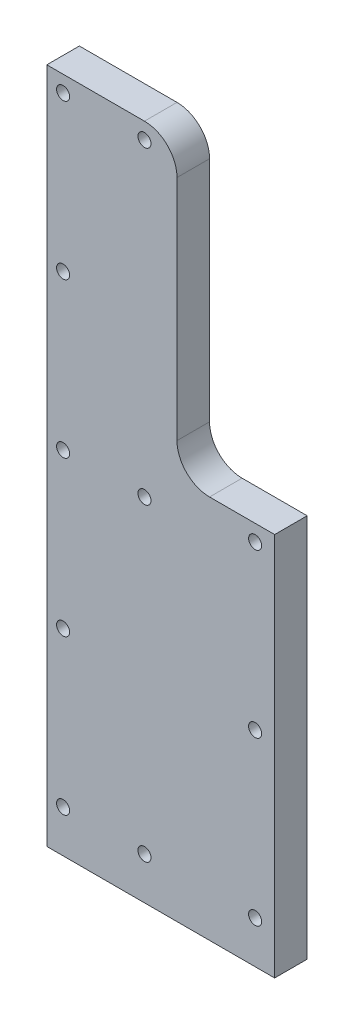
ISO-10303-21;
HEADER;
FILE_DESCRIPTION(('STEP AP214'),'2;1');
FILE_NAME('part.step','',(''),(''),'','','');
FILE_SCHEMA(('AUTOMOTIVE_DESIGN { 1 0 10303 214 1 1 1 1 }'));
ENDSEC;
DATA;
#1=APPLICATION_CONTEXT('core data for automotive mechanical design processes');
#2=APPLICATION_PROTOCOL_DEFINITION('international standard','automotive_design',2000,#1);
#3=PRODUCT_CONTEXT('',#1,'mechanical');
#4=PRODUCT('Part','Part','',(#3));
#5=PRODUCT_RELATED_PRODUCT_CATEGORY('part','',(#4));
#6=PRODUCT_DEFINITION_FORMATION('','',#4);
#7=PRODUCT_DEFINITION_CONTEXT('part definition',#1,'design');
#8=PRODUCT_DEFINITION('design','',#6,#7);
#9=PRODUCT_DEFINITION_SHAPE('','',#8);
#10=(LENGTH_UNIT() NAMED_UNIT(*) SI_UNIT(.MILLI.,.METRE.));
#11=(NAMED_UNIT(*) PLANE_ANGLE_UNIT() SI_UNIT($,.RADIAN.));
#12=(NAMED_UNIT(*) SI_UNIT($,.STERADIAN.) SOLID_ANGLE_UNIT());
#13=UNCERTAINTY_MEASURE_WITH_UNIT(LENGTH_MEASURE(1.E-05),#10,'distance_accuracy_value','');
#14=(GEOMETRIC_REPRESENTATION_CONTEXT(3) GLOBAL_UNCERTAINTY_ASSIGNED_CONTEXT((#13)) GLOBAL_UNIT_ASSIGNED_CONTEXT((#10,
#11,#12)) REPRESENTATION_CONTEXT('',''));
#15=CARTESIAN_POINT('',(0.,0.,0.));
#16=DIRECTION('',(0.,0.,1.));
#17=DIRECTION('',(1.,0.,0.));
#18=AXIS2_PLACEMENT_3D('',#15,#16,#17);
#19=CARTESIAN_POINT('',(70.,110.,10.));
#20=DIRECTION('',(-1.,0.,0.));
#21=DIRECTION('',(0.,-1.,0.));
#22=AXIS2_PLACEMENT_3D('',#19,#20,#21);
#23=PLANE('',#22);
#24=DIRECTION('',(0.,1.,0.));
#25=VECTOR('',#24,1.);
#26=CARTESIAN_POINT('',(70.,110.,0.));
#27=LINE('',#26,#25);
#28=CARTESIAN_POINT('',(70.,-8.,0.));
#29=VERTEX_POINT('',#28);
#30=CARTESIAN_POINT('',(70.,110.,0.));
#31=VERTEX_POINT('',#30);
#32=EDGE_CURVE('E142',#29,#31,#27,.T.);
#33=ORIENTED_EDGE('',*,*,#32,.T.);
#34=DIRECTION('',(0.,0.,-1.));
#35=VECTOR('',#34,1.);
#36=CARTESIAN_POINT('',(70.,110.,10.));
#37=LINE('',#36,#35);
#38=CARTESIAN_POINT('',(70.,110.,10.));
#39=VERTEX_POINT('',#38);
#40=EDGE_CURVE('E11',#39,#31,#37,.T.);
#41=ORIENTED_EDGE('',*,*,#40,.F.);
#42=DIRECTION('',(0.,1.,0.));
#43=VECTOR('',#42,1.);
#44=CARTESIAN_POINT('',(70.,110.,10.));
#45=LINE('',#44,#43);
#46=CARTESIAN_POINT('',(70.,-8.,10.));
#47=VERTEX_POINT('',#46);
#48=EDGE_CURVE('E100',#47,#39,#45,.T.);
#49=ORIENTED_EDGE('',*,*,#48,.F.);
#50=DIRECTION('',(0.,0.,1.));
#51=VECTOR('',#50,1.);
#52=CARTESIAN_POINT('',(70.,-8.,0.));
#53=LINE('',#52,#51);
#54=EDGE_CURVE('E198',#29,#47,#53,.T.);
#55=ORIENTED_EDGE('',*,*,#54,.F.);
#56=EDGE_LOOP('',(#33,#41,#49,#55));
#57=FACE_BOUND('',#56,.T.);
#58=ADVANCED_FACE('F45',(#57),#23,.F.);
#59=CARTESIAN_POINT('',(50.,110.,10.));
#60=DIRECTION('',(0.,-1.,0.));
#61=DIRECTION('',(0.,0.,-1.));
#62=AXIS2_PLACEMENT_3D('',#59,#60,#61);
#63=PLANE('',#62);
#64=DIRECTION('',(-1.,0.,0.));
#65=VECTOR('',#64,1.);
#66=CARTESIAN_POINT('',(50.,110.,0.));
#67=LINE('',#66,#65);
#68=CARTESIAN_POINT('',(50.,110.,0.));
#69=VERTEX_POINT('',#68);
#70=EDGE_CURVE('E145',#31,#69,#67,.T.);
#71=ORIENTED_EDGE('',*,*,#70,.T.);
#72=DIRECTION('',(0.,0.,-1.));
#73=VECTOR('',#72,1.);
#74=CARTESIAN_POINT('',(50.,110.,10.));
#75=LINE('',#74,#73);
#76=CARTESIAN_POINT('',(50.,110.,10.));
#77=VERTEX_POINT('',#76);
#78=EDGE_CURVE('E54',#77,#69,#75,.T.);
#79=ORIENTED_EDGE('',*,*,#78,.F.);
#80=DIRECTION('',(-1.,0.,0.));
#81=VECTOR('',#80,1.);
#82=CARTESIAN_POINT('',(50.,110.,10.));
#83=LINE('',#82,#81);
#84=EDGE_CURVE('E295',#39,#77,#83,.T.);
#85=ORIENTED_EDGE('',*,*,#84,.F.);
#86=ORIENTED_EDGE('',*,*,#40,.T.);
#87=EDGE_LOOP('',(#71,#79,#85,#86));
#88=FACE_BOUND('',#87,.T.);
#89=ADVANCED_FACE('F298',(#88),#63,.F.);
#90=CARTESIAN_POINT('',(50.,120.,10.));
#91=DIRECTION('',(0.,0.,-1.));
#92=DIRECTION('',(-1.,0.,0.));
#93=AXIS2_PLACEMENT_3D('',#90,#91,#92);
#94=CYLINDRICAL_SURFACE('',#93,10.);
#95=CARTESIAN_POINT('',(50.,120.,0.));
#96=DIRECTION('',(0.,0.,-1.));
#97=DIRECTION('',(1.,0.,0.));
#98=AXIS2_PLACEMENT_3D('',#95,#96,#97);
#99=CIRCLE('',#98,10.);
#100=CARTESIAN_POINT('',(40.,120.,0.));
#101=VERTEX_POINT('',#100);
#102=EDGE_CURVE('E149',#69,#101,#99,.T.);
#103=ORIENTED_EDGE('',*,*,#102,.T.);
#104=DIRECTION('',(0.,0.,-1.));
#105=VECTOR('',#104,1.);
#106=CARTESIAN_POINT('',(40.,120.,10.));
#107=LINE('',#106,#105);
#108=CARTESIAN_POINT('',(40.,120.,10.));
#109=VERTEX_POINT('',#108);
#110=EDGE_CURVE('E128',#109,#101,#107,.T.);
#111=ORIENTED_EDGE('',*,*,#110,.F.);
#112=CARTESIAN_POINT('',(50.,120.,10.));
#113=DIRECTION('',(0.,0.,-1.));
#114=DIRECTION('',(1.,0.,0.));
#115=AXIS2_PLACEMENT_3D('',#112,#113,#114);
#116=CIRCLE('',#115,10.);
#117=EDGE_CURVE('E117',#77,#109,#116,.T.);
#118=ORIENTED_EDGE('',*,*,#117,.F.);
#119=ORIENTED_EDGE('',*,*,#78,.T.);
#120=EDGE_LOOP('',(#103,#111,#118,#119));
#121=FACE_BOUND('',#120,.T.);
#122=ADVANCED_FACE('F172',(#121),#94,.F.);
#123=CARTESIAN_POINT('',(40.,190.,10.));
#124=DIRECTION('',(-1.,0.,0.));
#125=DIRECTION('',(0.,-1.,0.));
#126=AXIS2_PLACEMENT_3D('',#123,#124,#125);
#127=PLANE('',#126);
#128=DIRECTION('',(0.,1.,0.));
#129=VECTOR('',#128,1.);
#130=CARTESIAN_POINT('',(40.,190.,0.));
#131=LINE('',#130,#129);
#132=CARTESIAN_POINT('',(40.,190.,0.));
#133=VERTEX_POINT('',#132);
#134=EDGE_CURVE('E126',#101,#133,#131,.T.);
#135=ORIENTED_EDGE('',*,*,#134,.T.);
#136=DIRECTION('',(0.,0.,-1.));
#137=VECTOR('',#136,1.);
#138=CARTESIAN_POINT('',(40.,190.,10.));
#139=LINE('',#138,#137);
#140=CARTESIAN_POINT('',(40.,190.,10.));
#141=VERTEX_POINT('',#140);
#142=EDGE_CURVE('E123',#141,#133,#139,.T.);
#143=ORIENTED_EDGE('',*,*,#142,.F.);
#144=DIRECTION('',(0.,1.,0.));
#145=VECTOR('',#144,1.);
#146=CARTESIAN_POINT('',(40.,190.,10.));
#147=LINE('',#146,#145);
#148=EDGE_CURVE('E111',#109,#141,#147,.T.);
#149=ORIENTED_EDGE('',*,*,#148,.F.);
#150=ORIENTED_EDGE('',*,*,#110,.T.);
#151=EDGE_LOOP('',(#135,#143,#149,#150));
#152=FACE_BOUND('',#151,.T.);
#153=ADVANCED_FACE('F124',(#152),#127,.F.);
#154=CARTESIAN_POINT('',(30.,190.,10.));
#155=DIRECTION('',(0.,0.,-1.));
#156=DIRECTION('',(-1.,0.,0.));
#157=AXIS2_PLACEMENT_3D('',#154,#155,#156);
#158=CYLINDRICAL_SURFACE('',#157,10.);
#159=CARTESIAN_POINT('',(30.,190.,0.));
#160=DIRECTION('',(0.,0.,1.));
#161=DIRECTION('',(-1.,0.,0.));
#162=AXIS2_PLACEMENT_3D('',#159,#160,#161);
#163=CIRCLE('',#162,10.);
#164=CARTESIAN_POINT('',(30.,200.,0.));
#165=VERTEX_POINT('',#164);
#166=EDGE_CURVE('E86',#133,#165,#163,.T.);
#167=ORIENTED_EDGE('',*,*,#166,.T.);
#168=DIRECTION('',(0.,0.,-1.));
#169=VECTOR('',#168,1.);
#170=CARTESIAN_POINT('',(30.,200.,10.));
#171=LINE('',#170,#169);
#172=CARTESIAN_POINT('',(30.,200.,10.));
#173=VERTEX_POINT('',#172);
#174=EDGE_CURVE('E129',#173,#165,#171,.T.);
#175=ORIENTED_EDGE('',*,*,#174,.F.);
#176=CARTESIAN_POINT('',(30.,190.,10.));
#177=DIRECTION('',(0.,0.,1.));
#178=DIRECTION('',(-1.,0.,0.));
#179=AXIS2_PLACEMENT_3D('',#176,#177,#178);
#180=CIRCLE('',#179,10.);
#181=EDGE_CURVE('E115',#141,#173,#180,.T.);
#182=ORIENTED_EDGE('',*,*,#181,.F.);
#183=ORIENTED_EDGE('',*,*,#142,.T.);
#184=EDGE_LOOP('',(#167,#175,#182,#183));
#185=FACE_BOUND('',#184,.T.);
#186=ADVANCED_FACE('F131',(#185),#158,.T.);
#187=CARTESIAN_POINT('',(0.,200.,10.));
#188=DIRECTION('',(0.,-1.,0.));
#189=DIRECTION('',(0.,0.,-1.));
#190=AXIS2_PLACEMENT_3D('',#187,#188,#189);
#191=PLANE('',#190);
#192=DIRECTION('',(-1.,0.,0.));
#193=VECTOR('',#192,1.);
#194=CARTESIAN_POINT('',(0.,200.,0.));
#195=LINE('',#194,#193);
#196=CARTESIAN_POINT('',(0.,200.,0.));
#197=VERTEX_POINT('',#196);
#198=EDGE_CURVE('E92',#165,#197,#195,.T.);
#199=ORIENTED_EDGE('',*,*,#198,.T.);
#200=DIRECTION('',(0.,0.,-1.));
#201=VECTOR('',#200,1.);
#202=CARTESIAN_POINT('',(0.,200.,10.));
#203=LINE('',#202,#201);
#204=CARTESIAN_POINT('',(0.,200.,10.));
#205=VERTEX_POINT('',#204);
#206=EDGE_CURVE('E141',#205,#197,#203,.T.);
#207=ORIENTED_EDGE('',*,*,#206,.F.);
#208=DIRECTION('',(-1.,0.,0.));
#209=VECTOR('',#208,1.);
#210=CARTESIAN_POINT('',(0.,200.,10.));
#211=LINE('',#210,#209);
#212=EDGE_CURVE('E62',#173,#205,#211,.T.);
#213=ORIENTED_EDGE('',*,*,#212,.F.);
#214=ORIENTED_EDGE('',*,*,#174,.T.);
#215=EDGE_LOOP('',(#199,#207,#213,#214));
#216=FACE_BOUND('',#215,.T.);
#217=ADVANCED_FACE('F318',(#216),#191,.F.);
#218=CARTESIAN_POINT('',(0.,0.,10.));
#219=DIRECTION('',(1.,0.,0.));
#220=DIRECTION('',(0.,0.,-1.));
#221=AXIS2_PLACEMENT_3D('',#218,#219,#220);
#222=PLANE('',#221);
#223=DIRECTION('',(0.,-1.,0.));
#224=VECTOR('',#223,1.);
#225=CARTESIAN_POINT('',(0.,0.,0.));
#226=LINE('',#225,#224);
#227=CARTESIAN_POINT('',(0.,-8.00000000000001,0.));
#228=VERTEX_POINT('',#227);
#229=EDGE_CURVE('E158',#197,#228,#226,.T.);
#230=ORIENTED_EDGE('',*,*,#229,.T.);
#231=DIRECTION('',(0.,0.,1.));
#232=VECTOR('',#231,1.);
#233=CARTESIAN_POINT('',(0.,-8.00000000000001,0.));
#234=LINE('',#233,#232);
#235=CARTESIAN_POINT('',(0.,-8.00000000000001,10.));
#236=VERTEX_POINT('',#235);
#237=EDGE_CURVE('E190',#228,#236,#234,.T.);
#238=ORIENTED_EDGE('',*,*,#237,.T.);
#239=DIRECTION('',(0.,-1.,0.));
#240=VECTOR('',#239,1.);
#241=CARTESIAN_POINT('',(0.,0.,10.));
#242=LINE('',#241,#240);
#243=EDGE_CURVE('E135',#205,#236,#242,.T.);
#244=ORIENTED_EDGE('',*,*,#243,.F.);
#245=ORIENTED_EDGE('',*,*,#206,.T.);
#246=EDGE_LOOP('',(#230,#238,#244,#245));
#247=FACE_BOUND('',#246,.T.);
#248=ADVANCED_FACE('F187',(#247),#222,.F.);
#249=CARTESIAN_POINT('',(30.,190.,10.));
#250=DIRECTION('',(0.,0.,-1.));
#251=DIRECTION('',(-1.,0.,0.));
#252=AXIS2_PLACEMENT_3D('',#249,#250,#251);
#253=PLANE('',#252);
#254=CARTESIAN_POINT('',(5.00000000000049,147.5,10.));
#255=DIRECTION('',(0.,0.,1.));
#256=DIRECTION('',(1.,0.,0.));
#257=AXIS2_PLACEMENT_3D('',#254,#255,#256);
#258=CIRCLE('',#257,2.);
#259=CARTESIAN_POINT('',(7.0000000000005,147.5,10.));
#260=VERTEX_POINT('',#259);
#261=EDGE_CURVE('E223',#260,#260,#258,.T.);
#262=ORIENTED_EDGE('',*,*,#261,.F.);
#263=EDGE_LOOP('',(#262));
#264=FACE_BOUND('',#263,.T.);
#265=CARTESIAN_POINT('',(5.00000000000099,100.,10.));
#266=DIRECTION('',(0.,0.,1.));
#267=DIRECTION('',(1.,0.,0.));
#268=AXIS2_PLACEMENT_3D('',#265,#266,#267);
#269=CIRCLE('',#268,2.);
#270=CARTESIAN_POINT('',(7.00000000000099,100.,10.));
#271=VERTEX_POINT('',#270);
#272=EDGE_CURVE('E232',#271,#271,#269,.T.);
#273=ORIENTED_EDGE('',*,*,#272,.F.);
#274=EDGE_LOOP('',(#273));
#275=FACE_BOUND('',#274,.T.);
#276=CARTESIAN_POINT('',(5.00000000000148,52.5,10.));
#277=DIRECTION('',(0.,0.,1.));
#278=DIRECTION('',(1.,0.,0.));
#279=AXIS2_PLACEMENT_3D('',#276,#277,#278);
#280=CIRCLE('',#279,2.);
#281=CARTESIAN_POINT('',(7.00000000000149,52.5,10.));
#282=VERTEX_POINT('',#281);
#283=EDGE_CURVE('E240',#282,#282,#280,.T.);
#284=ORIENTED_EDGE('',*,*,#283,.F.);
#285=EDGE_LOOP('',(#284));
#286=FACE_BOUND('',#285,.T.);
#287=CARTESIAN_POINT('',(5.00000000000197,5.,10.));
#288=DIRECTION('',(0.,0.,1.));
#289=DIRECTION('',(1.,0.,0.));
#290=AXIS2_PLACEMENT_3D('',#287,#288,#289);
#291=CIRCLE('',#290,2.);
#292=CARTESIAN_POINT('',(7.00000000000197,5.,10.));
#293=VERTEX_POINT('',#292);
#294=EDGE_CURVE('E248',#293,#293,#291,.T.);
#295=ORIENTED_EDGE('',*,*,#294,.F.);
#296=EDGE_LOOP('',(#295));
#297=FACE_BOUND('',#296,.T.);
#298=CARTESIAN_POINT('',(30.,195.,10.));
#299=DIRECTION('',(0.,0.,1.));
#300=DIRECTION('',(1.,0.,0.));
#301=AXIS2_PLACEMENT_3D('',#298,#299,#300);
#302=CIRCLE('',#301,2.);
#303=CARTESIAN_POINT('',(32.,195.,10.));
#304=VERTEX_POINT('',#303);
#305=EDGE_CURVE('E266',#304,#304,#302,.T.);
#306=ORIENTED_EDGE('',*,*,#305,.F.);
#307=EDGE_LOOP('',(#306));
#308=FACE_BOUND('',#307,.T.);
#309=CARTESIAN_POINT('',(64.0000000000011,5.,10.));
#310=DIRECTION('',(0.,0.,1.));
#311=DIRECTION('',(1.,0.,0.));
#312=AXIS2_PLACEMENT_3D('',#309,#310,#311);
#313=CIRCLE('',#312,2.);
#314=CARTESIAN_POINT('',(66.0000000000011,5.,10.));
#315=VERTEX_POINT('',#314);
#316=EDGE_CURVE('E257',#315,#315,#313,.T.);
#317=ORIENTED_EDGE('',*,*,#316,.F.);
#318=EDGE_LOOP('',(#317));
#319=FACE_BOUND('',#318,.T.);
#320=CARTESIAN_POINT('',(64.0000000000005,55.,10.));
#321=DIRECTION('',(0.,0.,1.));
#322=DIRECTION('',(1.,0.,0.));
#323=AXIS2_PLACEMENT_3D('',#320,#321,#322);
#324=CIRCLE('',#323,2.);
#325=CARTESIAN_POINT('',(66.0000000000005,55.,10.));
#326=VERTEX_POINT('',#325);
#327=EDGE_CURVE('E280',#326,#326,#324,.T.);
#328=ORIENTED_EDGE('',*,*,#327,.F.);
#329=EDGE_LOOP('',(#328));
#330=FACE_BOUND('',#329,.T.);
#331=CARTESIAN_POINT('',(64.,105.,10.));
#332=DIRECTION('',(0.,0.,1.));
#333=DIRECTION('',(1.,0.,0.));
#334=AXIS2_PLACEMENT_3D('',#331,#332,#333);
#335=CIRCLE('',#334,2.);
#336=CARTESIAN_POINT('',(66.,105.,10.));
#337=VERTEX_POINT('',#336);
#338=EDGE_CURVE('E256',#337,#337,#335,.T.);
#339=ORIENTED_EDGE('',*,*,#338,.F.);
#340=EDGE_LOOP('',(#339));
#341=FACE_BOUND('',#340,.T.);
#342=CARTESIAN_POINT('',(30.000000000001,100.,10.));
#343=DIRECTION('',(0.,0.,1.));
#344=DIRECTION('',(1.,0.,0.));
#345=AXIS2_PLACEMENT_3D('',#342,#343,#344);
#346=CIRCLE('',#345,2.);
#347=CARTESIAN_POINT('',(32.000000000001,100.,10.));
#348=VERTEX_POINT('',#347);
#349=EDGE_CURVE('E207',#348,#348,#346,.T.);
#350=ORIENTED_EDGE('',*,*,#349,.F.);
#351=EDGE_LOOP('',(#350));
#352=FACE_BOUND('',#351,.T.);
#353=CARTESIAN_POINT('',(30.000000000002,5.,10.));
#354=DIRECTION('',(0.,0.,1.));
#355=DIRECTION('',(1.,0.,0.));
#356=AXIS2_PLACEMENT_3D('',#353,#354,#355);
#357=CIRCLE('',#356,2.);
#358=CARTESIAN_POINT('',(32.000000000002,5.,10.));
#359=VERTEX_POINT('',#358);
#360=EDGE_CURVE('E216',#359,#359,#357,.T.);
#361=ORIENTED_EDGE('',*,*,#360,.F.);
#362=EDGE_LOOP('',(#361));
#363=FACE_BOUND('',#362,.T.);
#364=CARTESIAN_POINT('',(5.,195.,10.));
#365=DIRECTION('',(0.,0.,1.));
#366=DIRECTION('',(1.,0.,0.));
#367=AXIS2_PLACEMENT_3D('',#364,#365,#366);
#368=CIRCLE('',#367,2.);
#369=CARTESIAN_POINT('',(7.,195.,10.));
#370=VERTEX_POINT('',#369);
#371=EDGE_CURVE('E227',#370,#370,#368,.T.);
#372=ORIENTED_EDGE('',*,*,#371,.F.);
#373=EDGE_LOOP('',(#372));
#374=FACE_BOUND('',#373,.T.);
#375=ORIENTED_EDGE('',*,*,#243,.T.);
#376=DIRECTION('',(1.,0.,0.));
#377=VECTOR('',#376,1.);
#378=CARTESIAN_POINT('',(70.,-8.,10.));
#379=LINE('',#378,#377);
#380=EDGE_CURVE('E196',#236,#47,#379,.T.);
#381=ORIENTED_EDGE('',*,*,#380,.T.);
#382=ORIENTED_EDGE('',*,*,#48,.T.);
#383=ORIENTED_EDGE('',*,*,#84,.T.);
#384=ORIENTED_EDGE('',*,*,#117,.T.);
#385=ORIENTED_EDGE('',*,*,#148,.T.);
#386=ORIENTED_EDGE('',*,*,#181,.T.);
#387=ORIENTED_EDGE('',*,*,#212,.T.);
#388=EDGE_LOOP('',(#375,#381,#382,#383,#384,#385,#386,#387));
#389=FACE_BOUND('',#388,.T.);
#390=ADVANCED_FACE('F113',(#264,#275,#286,#297,#308,#319,#330,#341,#352,#363,#374,#389),#253,.F.);
#391=CARTESIAN_POINT('',(30.,190.,0.));
#392=DIRECTION('',(0.,0.,-1.));
#393=DIRECTION('',(-1.,0.,0.));
#394=AXIS2_PLACEMENT_3D('',#391,#392,#393);
#395=PLANE('',#394);
#396=CARTESIAN_POINT('',(5.00000000000049,147.5,0.));
#397=DIRECTION('',(0.,0.,1.));
#398=DIRECTION('',(1.,0.,0.));
#399=AXIS2_PLACEMENT_3D('',#396,#397,#398);
#400=CIRCLE('',#399,2.);
#401=CARTESIAN_POINT('',(7.0000000000005,147.5,0.));
#402=VERTEX_POINT('',#401);
#403=EDGE_CURVE('E228',#402,#402,#400,.T.);
#404=ORIENTED_EDGE('',*,*,#403,.T.);
#405=EDGE_LOOP('',(#404));
#406=FACE_BOUND('',#405,.T.);
#407=CARTESIAN_POINT('',(5.00000000000099,100.,0.));
#408=DIRECTION('',(0.,0.,1.));
#409=DIRECTION('',(1.,0.,0.));
#410=AXIS2_PLACEMENT_3D('',#407,#408,#409);
#411=CIRCLE('',#410,2.);
#412=CARTESIAN_POINT('',(7.00000000000099,100.,0.));
#413=VERTEX_POINT('',#412);
#414=EDGE_CURVE('E236',#413,#413,#411,.T.);
#415=ORIENTED_EDGE('',*,*,#414,.T.);
#416=EDGE_LOOP('',(#415));
#417=FACE_BOUND('',#416,.T.);
#418=CARTESIAN_POINT('',(5.00000000000148,52.5,0.));
#419=DIRECTION('',(0.,0.,1.));
#420=DIRECTION('',(1.,0.,0.));
#421=AXIS2_PLACEMENT_3D('',#418,#419,#420);
#422=CIRCLE('',#421,2.);
#423=CARTESIAN_POINT('',(7.00000000000149,52.5,0.));
#424=VERTEX_POINT('',#423);
#425=EDGE_CURVE('E244',#424,#424,#422,.T.);
#426=ORIENTED_EDGE('',*,*,#425,.T.);
#427=EDGE_LOOP('',(#426));
#428=FACE_BOUND('',#427,.T.);
#429=CARTESIAN_POINT('',(5.00000000000197,5.,0.));
#430=DIRECTION('',(0.,0.,1.));
#431=DIRECTION('',(1.,0.,0.));
#432=AXIS2_PLACEMENT_3D('',#429,#430,#431);
#433=CIRCLE('',#432,2.);
#434=CARTESIAN_POINT('',(7.00000000000197,5.,0.));
#435=VERTEX_POINT('',#434);
#436=EDGE_CURVE('E252',#435,#435,#433,.T.);
#437=ORIENTED_EDGE('',*,*,#436,.T.);
#438=EDGE_LOOP('',(#437));
#439=FACE_BOUND('',#438,.T.);
#440=CARTESIAN_POINT('',(30.,195.,0.));
#441=DIRECTION('',(0.,0.,1.));
#442=DIRECTION('',(1.,0.,0.));
#443=AXIS2_PLACEMENT_3D('',#440,#441,#442);
#444=CIRCLE('',#443,2.);
#445=CARTESIAN_POINT('',(32.,195.,0.));
#446=VERTEX_POINT('',#445);
#447=EDGE_CURVE('E211',#446,#446,#444,.T.);
#448=ORIENTED_EDGE('',*,*,#447,.T.);
#449=EDGE_LOOP('',(#448));
#450=FACE_BOUND('',#449,.T.);
#451=CARTESIAN_POINT('',(64.0000000000011,5.,0.));
#452=DIRECTION('',(0.,0.,1.));
#453=DIRECTION('',(1.,0.,0.));
#454=AXIS2_PLACEMENT_3D('',#451,#452,#453);
#455=CIRCLE('',#454,2.);
#456=CARTESIAN_POINT('',(66.0000000000011,5.,0.));
#457=VERTEX_POINT('',#456);
#458=EDGE_CURVE('E262',#457,#457,#455,.T.);
#459=ORIENTED_EDGE('',*,*,#458,.T.);
#460=EDGE_LOOP('',(#459));
#461=FACE_BOUND('',#460,.T.);
#462=CARTESIAN_POINT('',(64.0000000000005,55.,0.));
#463=DIRECTION('',(0.,0.,1.));
#464=DIRECTION('',(1.,0.,0.));
#465=AXIS2_PLACEMENT_3D('',#462,#463,#464);
#466=CIRCLE('',#465,2.);
#467=CARTESIAN_POINT('',(66.0000000000005,55.,0.));
#468=VERTEX_POINT('',#467);
#469=EDGE_CURVE('E261',#468,#468,#466,.T.);
#470=ORIENTED_EDGE('',*,*,#469,.T.);
#471=EDGE_LOOP('',(#470));
#472=FACE_BOUND('',#471,.T.);
#473=CARTESIAN_POINT('',(64.,105.,0.));
#474=DIRECTION('',(0.,0.,1.));
#475=DIRECTION('',(1.,0.,0.));
#476=AXIS2_PLACEMENT_3D('',#473,#474,#475);
#477=CIRCLE('',#476,2.);
#478=CARTESIAN_POINT('',(66.,105.,0.));
#479=VERTEX_POINT('',#478);
#480=EDGE_CURVE('E276',#479,#479,#477,.T.);
#481=ORIENTED_EDGE('',*,*,#480,.T.);
#482=EDGE_LOOP('',(#481));
#483=FACE_BOUND('',#482,.T.);
#484=CARTESIAN_POINT('',(30.000000000001,100.,0.));
#485=DIRECTION('',(0.,0.,1.));
#486=DIRECTION('',(1.,0.,0.));
#487=AXIS2_PLACEMENT_3D('',#484,#485,#486);
#488=CIRCLE('',#487,2.);
#489=CARTESIAN_POINT('',(32.000000000001,100.,0.));
#490=VERTEX_POINT('',#489);
#491=EDGE_CURVE('E212',#490,#490,#488,.T.);
#492=ORIENTED_EDGE('',*,*,#491,.T.);
#493=EDGE_LOOP('',(#492));
#494=FACE_BOUND('',#493,.T.);
#495=CARTESIAN_POINT('',(30.000000000002,5.,0.));
#496=DIRECTION('',(0.,0.,1.));
#497=DIRECTION('',(1.,0.,0.));
#498=AXIS2_PLACEMENT_3D('',#495,#496,#497);
#499=CIRCLE('',#498,2.);
#500=CARTESIAN_POINT('',(32.000000000002,5.,0.));
#501=VERTEX_POINT('',#500);
#502=EDGE_CURVE('E202',#501,#501,#499,.T.);
#503=ORIENTED_EDGE('',*,*,#502,.T.);
#504=EDGE_LOOP('',(#503));
#505=FACE_BOUND('',#504,.T.);
#506=CARTESIAN_POINT('',(5.,195.,0.));
#507=DIRECTION('',(0.,0.,1.));
#508=DIRECTION('',(1.,0.,0.));
#509=AXIS2_PLACEMENT_3D('',#506,#507,#508);
#510=CIRCLE('',#509,2.);
#511=CARTESIAN_POINT('',(7.,195.,0.));
#512=VERTEX_POINT('',#511);
#513=EDGE_CURVE('E146',#512,#512,#510,.T.);
#514=ORIENTED_EDGE('',*,*,#513,.T.);
#515=EDGE_LOOP('',(#514));
#516=FACE_BOUND('',#515,.T.);
#517=ORIENTED_EDGE('',*,*,#32,.F.);
#518=DIRECTION('',(1.,0.,0.));
#519=VECTOR('',#518,1.);
#520=CARTESIAN_POINT('',(70.,-8.,0.));
#521=LINE('',#520,#519);
#522=EDGE_CURVE('E183',#228,#29,#521,.T.);
#523=ORIENTED_EDGE('',*,*,#522,.F.);
#524=ORIENTED_EDGE('',*,*,#229,.F.);
#525=ORIENTED_EDGE('',*,*,#198,.F.);
#526=ORIENTED_EDGE('',*,*,#166,.F.);
#527=ORIENTED_EDGE('',*,*,#134,.F.);
#528=ORIENTED_EDGE('',*,*,#102,.F.);
#529=ORIENTED_EDGE('',*,*,#70,.F.);
#530=EDGE_LOOP('',(#517,#523,#524,#525,#526,#527,#528,#529));
#531=FACE_BOUND('',#530,.T.);
#532=ADVANCED_FACE('F178',(#406,#417,#428,#439,#450,#461,#472,#483,#494,#505,#516,#531),#395,.T.);
#533=CARTESIAN_POINT('',(5.,195.,0.));
#534=DIRECTION('',(0.,0.,1.));
#535=DIRECTION('',(1.,0.,0.));
#536=AXIS2_PLACEMENT_3D('',#533,#534,#535);
#537=CYLINDRICAL_SURFACE('',#536,2.);
#538=ORIENTED_EDGE('',*,*,#513,.F.);
#539=EDGE_LOOP('',(#538));
#540=FACE_BOUND('',#539,.T.);
#541=ORIENTED_EDGE('',*,*,#371,.T.);
#542=EDGE_LOOP('',(#541));
#543=FACE_BOUND('',#542,.T.);
#544=ADVANCED_FACE('F324',(#540,#543),#537,.F.);
#545=CARTESIAN_POINT('',(30.000000000002,5.,0.));
#546=DIRECTION('',(0.,0.,1.));
#547=DIRECTION('',(1.,0.,0.));
#548=AXIS2_PLACEMENT_3D('',#545,#546,#547);
#549=CYLINDRICAL_SURFACE('',#548,2.);
#550=ORIENTED_EDGE('',*,*,#502,.F.);
#551=EDGE_LOOP('',(#550));
#552=FACE_BOUND('',#551,.T.);
#553=ORIENTED_EDGE('',*,*,#360,.T.);
#554=EDGE_LOOP('',(#553));
#555=FACE_BOUND('',#554,.T.);
#556=ADVANCED_FACE('F331',(#552,#555),#549,.F.);
#557=CARTESIAN_POINT('',(30.000000000001,100.,0.));
#558=DIRECTION('',(0.,0.,1.));
#559=DIRECTION('',(1.,0.,0.));
#560=AXIS2_PLACEMENT_3D('',#557,#558,#559);
#561=CYLINDRICAL_SURFACE('',#560,2.);
#562=ORIENTED_EDGE('',*,*,#491,.F.);
#563=EDGE_LOOP('',(#562));
#564=FACE_BOUND('',#563,.T.);
#565=ORIENTED_EDGE('',*,*,#349,.T.);
#566=EDGE_LOOP('',(#565));
#567=FACE_BOUND('',#566,.T.);
#568=ADVANCED_FACE('F341',(#564,#567),#561,.F.);
#569=CARTESIAN_POINT('',(64.,105.,0.));
#570=DIRECTION('',(0.,0.,1.));
#571=DIRECTION('',(1.,0.,0.));
#572=AXIS2_PLACEMENT_3D('',#569,#570,#571);
#573=CYLINDRICAL_SURFACE('',#572,2.);
#574=ORIENTED_EDGE('',*,*,#480,.F.);
#575=EDGE_LOOP('',(#574));
#576=FACE_BOUND('',#575,.T.);
#577=ORIENTED_EDGE('',*,*,#338,.T.);
#578=EDGE_LOOP('',(#577));
#579=FACE_BOUND('',#578,.T.);
#580=ADVANCED_FACE('F337',(#576,#579),#573,.F.);
#581=CARTESIAN_POINT('',(64.0000000000005,55.,0.));
#582=DIRECTION('',(0.,0.,1.));
#583=DIRECTION('',(1.,0.,0.));
#584=AXIS2_PLACEMENT_3D('',#581,#582,#583);
#585=CYLINDRICAL_SURFACE('',#584,2.);
#586=ORIENTED_EDGE('',*,*,#469,.F.);
#587=EDGE_LOOP('',(#586));
#588=FACE_BOUND('',#587,.T.);
#589=ORIENTED_EDGE('',*,*,#327,.T.);
#590=EDGE_LOOP('',(#589));
#591=FACE_BOUND('',#590,.T.);
#592=ADVANCED_FACE('F333',(#588,#591),#585,.F.);
#593=CARTESIAN_POINT('',(64.0000000000011,5.,0.));
#594=DIRECTION('',(0.,0.,1.));
#595=DIRECTION('',(1.,0.,0.));
#596=AXIS2_PLACEMENT_3D('',#593,#594,#595);
#597=CYLINDRICAL_SURFACE('',#596,2.);
#598=ORIENTED_EDGE('',*,*,#458,.F.);
#599=EDGE_LOOP('',(#598));
#600=FACE_BOUND('',#599,.T.);
#601=ORIENTED_EDGE('',*,*,#316,.T.);
#602=EDGE_LOOP('',(#601));
#603=FACE_BOUND('',#602,.T.);
#604=ADVANCED_FACE('F336',(#600,#603),#597,.F.);
#605=CARTESIAN_POINT('',(30.,195.,0.));
#606=DIRECTION('',(0.,0.,1.));
#607=DIRECTION('',(1.,0.,0.));
#608=AXIS2_PLACEMENT_3D('',#605,#606,#607);
#609=CYLINDRICAL_SURFACE('',#608,2.);
#610=ORIENTED_EDGE('',*,*,#447,.F.);
#611=EDGE_LOOP('',(#610));
#612=FACE_BOUND('',#611,.T.);
#613=ORIENTED_EDGE('',*,*,#305,.T.);
#614=EDGE_LOOP('',(#613));
#615=FACE_BOUND('',#614,.T.);
#616=ADVANCED_FACE('F343',(#612,#615),#609,.F.);
#617=CARTESIAN_POINT('',(5.00000000000197,5.,0.));
#618=DIRECTION('',(0.,0.,1.));
#619=DIRECTION('',(1.,0.,0.));
#620=AXIS2_PLACEMENT_3D('',#617,#618,#619);
#621=CYLINDRICAL_SURFACE('',#620,2.);
#622=ORIENTED_EDGE('',*,*,#436,.F.);
#623=EDGE_LOOP('',(#622));
#624=FACE_BOUND('',#623,.T.);
#625=ORIENTED_EDGE('',*,*,#294,.T.);
#626=EDGE_LOOP('',(#625));
#627=FACE_BOUND('',#626,.T.);
#628=ADVANCED_FACE('F346',(#624,#627),#621,.F.);
#629=CARTESIAN_POINT('',(5.00000000000148,52.5,0.));
#630=DIRECTION('',(0.,0.,1.));
#631=DIRECTION('',(1.,0.,0.));
#632=AXIS2_PLACEMENT_3D('',#629,#630,#631);
#633=CYLINDRICAL_SURFACE('',#632,2.);
#634=ORIENTED_EDGE('',*,*,#425,.F.);
#635=EDGE_LOOP('',(#634));
#636=FACE_BOUND('',#635,.T.);
#637=ORIENTED_EDGE('',*,*,#283,.T.);
#638=EDGE_LOOP('',(#637));
#639=FACE_BOUND('',#638,.T.);
#640=ADVANCED_FACE('F353',(#636,#639),#633,.F.);
#641=CARTESIAN_POINT('',(5.00000000000099,100.,0.));
#642=DIRECTION('',(0.,0.,1.));
#643=DIRECTION('',(1.,0.,0.));
#644=AXIS2_PLACEMENT_3D('',#641,#642,#643);
#645=CYLINDRICAL_SURFACE('',#644,2.);
#646=ORIENTED_EDGE('',*,*,#414,.F.);
#647=EDGE_LOOP('',(#646));
#648=FACE_BOUND('',#647,.T.);
#649=ORIENTED_EDGE('',*,*,#272,.T.);
#650=EDGE_LOOP('',(#649));
#651=FACE_BOUND('',#650,.T.);
#652=ADVANCED_FACE('F357',(#648,#651),#645,.F.);
#653=CARTESIAN_POINT('',(5.00000000000049,147.5,0.));
#654=DIRECTION('',(0.,0.,1.));
#655=DIRECTION('',(1.,0.,0.));
#656=AXIS2_PLACEMENT_3D('',#653,#654,#655);
#657=CYLINDRICAL_SURFACE('',#656,2.);
#658=ORIENTED_EDGE('',*,*,#403,.F.);
#659=EDGE_LOOP('',(#658));
#660=FACE_BOUND('',#659,.T.);
#661=ORIENTED_EDGE('',*,*,#261,.T.);
#662=EDGE_LOOP('',(#661));
#663=FACE_BOUND('',#662,.T.);
#664=ADVANCED_FACE('F361',(#660,#663),#657,.F.);
#665=CARTESIAN_POINT('',(70.,-8.,0.));
#666=DIRECTION('',(0.,-1.,0.));
#667=DIRECTION('',(1.,0.,0.));
#668=AXIS2_PLACEMENT_3D('',#665,#666,#667);
#669=PLANE('',#668);
#670=ORIENTED_EDGE('',*,*,#380,.F.);
#671=ORIENTED_EDGE('',*,*,#237,.F.);
#672=ORIENTED_EDGE('',*,*,#522,.T.);
#673=ORIENTED_EDGE('',*,*,#54,.T.);
#674=EDGE_LOOP('',(#670,#671,#672,#673));
#675=FACE_BOUND('',#674,.T.);
#676=ADVANCED_FACE('F194',(#675),#669,.T.);
#677=CLOSED_SHELL('',(#58,#89,#122,#153,#186,#217,#248,#390,#532,#544,#556,#568,#580,#592,#604,
#616,#628,#640,#652,#664,#676));
#678=MANIFOLD_SOLID_BREP('B2',#677);
#679=ADVANCED_BREP_SHAPE_REPRESENTATION('',(#18,#678),#14);
#680=SHAPE_DEFINITION_REPRESENTATION(#9,#679);
ENDSEC;
END-ISO-10303-21;
